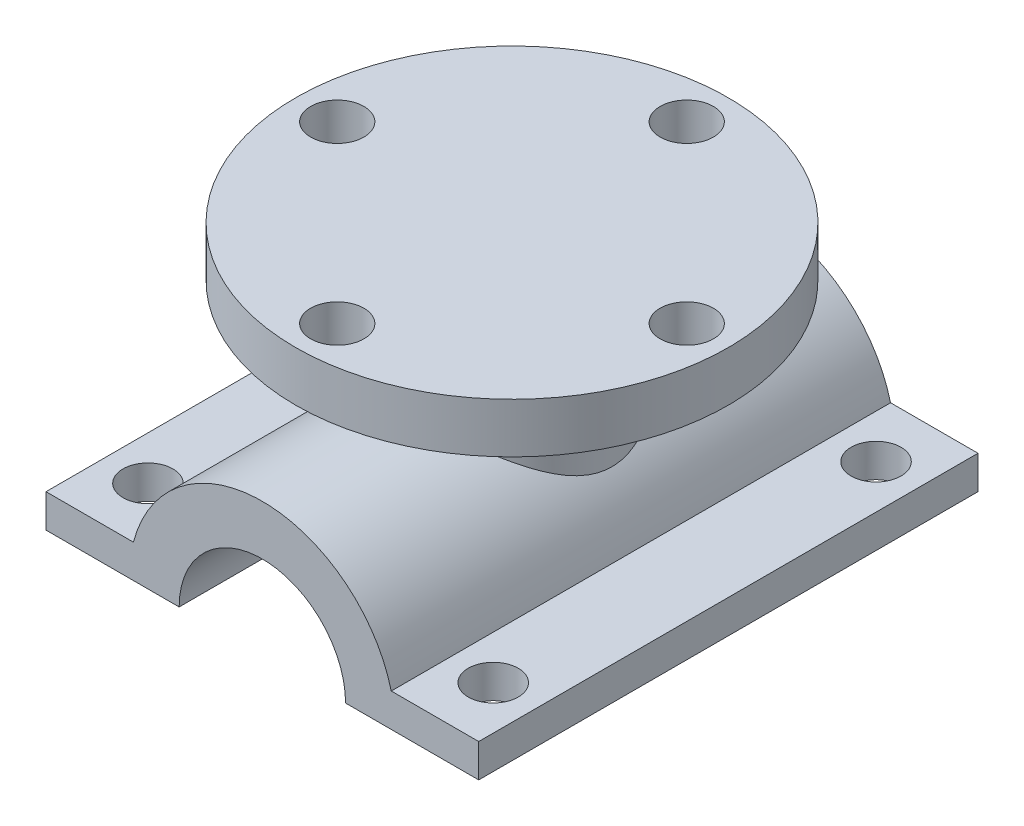
ISO-10303-21;
HEADER;
FILE_DESCRIPTION(('STEP AP214'),'2;1');
FILE_NAME('part.step','',(''),(''),'','','');
FILE_SCHEMA(('AUTOMOTIVE_DESIGN { 1 0 10303 214 1 1 1 1 }'));
ENDSEC;
DATA;
#1=APPLICATION_CONTEXT('core data for automotive mechanical design processes');
#2=APPLICATION_PROTOCOL_DEFINITION('international standard','automotive_design',2000,#1);
#3=PRODUCT_CONTEXT('',#1,'mechanical');
#4=PRODUCT('Part','Part','',(#3));
#5=PRODUCT_RELATED_PRODUCT_CATEGORY('part','',(#4));
#6=PRODUCT_DEFINITION_FORMATION('','',#4);
#7=PRODUCT_DEFINITION_CONTEXT('part definition',#1,'design');
#8=PRODUCT_DEFINITION('design','',#6,#7);
#9=PRODUCT_DEFINITION_SHAPE('','',#8);
#10=(LENGTH_UNIT() NAMED_UNIT(*) SI_UNIT(.MILLI.,.METRE.));
#11=(NAMED_UNIT(*) PLANE_ANGLE_UNIT() SI_UNIT($,.RADIAN.));
#12=(NAMED_UNIT(*) SI_UNIT($,.STERADIAN.) SOLID_ANGLE_UNIT());
#13=UNCERTAINTY_MEASURE_WITH_UNIT(LENGTH_MEASURE(1.E-05),#10,'distance_accuracy_value','');
#14=(GEOMETRIC_REPRESENTATION_CONTEXT(3) GLOBAL_UNCERTAINTY_ASSIGNED_CONTEXT((#13)) GLOBAL_UNIT_ASSIGNED_CONTEXT((#10,
#11,#12)) REPRESENTATION_CONTEXT('',''));
#15=CARTESIAN_POINT('',(0.,0.,0.));
#16=DIRECTION('',(0.,0.,1.));
#17=DIRECTION('',(1.,0.,0.));
#18=AXIS2_PLACEMENT_3D('',#15,#16,#17);
#19=CARTESIAN_POINT('',(13.,0.,30.));
#20=DIRECTION('',(-1.,0.,0.));
#21=DIRECTION('',(0.,0.,1.));
#22=AXIS2_PLACEMENT_3D('',#19,#20,#21);
#23=PLANE('',#22);
#24=DIRECTION('',(0.,1.,0.));
#25=VECTOR('',#24,1.);
#26=CARTESIAN_POINT('',(13.,0.,0.));
#27=LINE('',#26,#25);
#28=CARTESIAN_POINT('',(13.,0.,0.));
#29=VERTEX_POINT('',#28);
#30=CARTESIAN_POINT('',(13.,2.00000000000001,0.));
#31=VERTEX_POINT('',#30);
#32=EDGE_CURVE('E135',#29,#31,#27,.T.);
#33=ORIENTED_EDGE('',*,*,#32,.T.);
#34=DIRECTION('',(0.,0.,-1.));
#35=VECTOR('',#34,1.);
#36=CARTESIAN_POINT('',(13.,2.00000000000001,30.));
#37=LINE('',#36,#35);
#38=CARTESIAN_POINT('',(13.,2.00000000000001,30.));
#39=VERTEX_POINT('',#38);
#40=EDGE_CURVE('E11',#39,#31,#37,.T.);
#41=ORIENTED_EDGE('',*,*,#40,.F.);
#42=DIRECTION('',(0.,1.,0.));
#43=VECTOR('',#42,1.);
#44=CARTESIAN_POINT('',(13.,0.,30.));
#45=LINE('',#44,#43);
#46=CARTESIAN_POINT('',(13.,0.,30.));
#47=VERTEX_POINT('',#46);
#48=EDGE_CURVE('E152',#47,#39,#45,.T.);
#49=ORIENTED_EDGE('',*,*,#48,.F.);
#50=DIRECTION('',(0.,0.,-1.));
#51=VECTOR('',#50,1.);
#52=CARTESIAN_POINT('',(13.,0.,30.));
#53=LINE('',#52,#51);
#54=EDGE_CURVE('E131',#47,#29,#53,.T.);
#55=ORIENTED_EDGE('',*,*,#54,.T.);
#56=EDGE_LOOP('',(#33,#41,#49,#55));
#57=FACE_BOUND('',#56,.T.);
#58=ADVANCED_FACE('F37',(#57),#23,.F.);
#59=CARTESIAN_POINT('',(13.,2.00000000000001,30.));
#60=DIRECTION('',(0.,-1.,0.));
#61=DIRECTION('',(0.,0.,-1.));
#62=AXIS2_PLACEMENT_3D('',#59,#60,#61);
#63=PLANE('',#62);
#64=CARTESIAN_POINT('',(10.3729833462074,2.00000000000001,26.5));
#65=DIRECTION('',(0.,1.,0.));
#66=DIRECTION('',(0.,0.,-1.));
#67=AXIS2_PLACEMENT_3D('',#64,#65,#66);
#68=CIRCLE('',#67,1.5);
#69=CARTESIAN_POINT('',(10.3729833462074,2.00000000000001,25.));
#70=VERTEX_POINT('',#69);
#71=EDGE_CURVE('E170',#70,#70,#68,.T.);
#72=ORIENTED_EDGE('',*,*,#71,.F.);
#73=EDGE_LOOP('',(#72));
#74=FACE_BOUND('',#73,.T.);
#75=CARTESIAN_POINT('',(10.3729833462074,2.00000000000001,3.5));
#76=DIRECTION('',(0.,1.,0.));
#77=DIRECTION('',(0.,0.,1.));
#78=AXIS2_PLACEMENT_3D('',#75,#76,#77);
#79=CIRCLE('',#78,1.5);
#80=CARTESIAN_POINT('',(10.3729833462074,2.00000000000001,5.));
#81=VERTEX_POINT('',#80);
#82=EDGE_CURVE('E166',#81,#81,#79,.T.);
#83=ORIENTED_EDGE('',*,*,#82,.F.);
#84=EDGE_LOOP('',(#83));
#85=FACE_BOUND('',#84,.T.);
#86=DIRECTION('',(-1.,0.,0.));
#87=VECTOR('',#86,1.);
#88=CARTESIAN_POINT('',(13.,2.00000000000001,0.));
#89=LINE('',#88,#87);
#90=CARTESIAN_POINT('',(7.74596669241483,2.00000000000001,0.));
#91=VERTEX_POINT('',#90);
#92=EDGE_CURVE('E138',#31,#91,#89,.T.);
#93=ORIENTED_EDGE('',*,*,#92,.T.);
#94=DIRECTION('',(0.,0.,-1.));
#95=VECTOR('',#94,1.);
#96=CARTESIAN_POINT('',(7.74596669241483,2.00000000000001,30.));
#97=LINE('',#96,#95);
#98=CARTESIAN_POINT('',(7.74596669241483,2.00000000000001,30.));
#99=VERTEX_POINT('',#98);
#100=EDGE_CURVE('E46',#99,#91,#97,.T.);
#101=ORIENTED_EDGE('',*,*,#100,.F.);
#102=DIRECTION('',(-1.,0.,0.));
#103=VECTOR('',#102,1.);
#104=CARTESIAN_POINT('',(13.,2.00000000000001,30.));
#105=LINE('',#104,#103);
#106=EDGE_CURVE('E96',#39,#99,#105,.T.);
#107=ORIENTED_EDGE('',*,*,#106,.F.);
#108=ORIENTED_EDGE('',*,*,#40,.T.);
#109=EDGE_LOOP('',(#93,#101,#107,#108));
#110=FACE_BOUND('',#109,.T.);
#111=ADVANCED_FACE('F206',(#74,#85,#110),#63,.F.);
#112=CARTESIAN_POINT('',(0.,0.,30.));
#113=DIRECTION('',(0.,0.,-1.));
#114=DIRECTION('',(-1.,0.,0.));
#115=AXIS2_PLACEMENT_3D('',#112,#113,#114);
#116=CYLINDRICAL_SURFACE('',#115,8.);
#117=CARTESIAN_POINT('',(0.,8.,21.));
#118=CARTESIAN_POINT('',(0.146518688517614,7.99999860171174,20.9999985511193));
#119=CARTESIAN_POINT('',(0.293074068111853,7.99596497360399,20.9946232346861));
#120=CARTESIAN_POINT('',(0.585027718343882,7.97992114502227,20.9732060285274));
#121=CARTESIAN_POINT('',(0.730425243893793,7.96790617164547,20.9571577562897));
#122=CARTESIAN_POINT('',(1.01911421051197,7.93615343039507,20.914620197954));
#123=CARTESIAN_POINT('',(1.16240109542145,7.91640094683802,20.8881110159266));
#124=CARTESIAN_POINT('',(1.44559149803457,7.86961738087969,20.8250599741253));
#125=CARTESIAN_POINT('',(1.5854934751382,7.84258304970853,20.7885136361676));
#126=CARTESIAN_POINT('',(1.86005596235381,7.78201902509685,20.7061890573971));
#127=CARTESIAN_POINT('',(1.99474491007821,7.74853325374254,20.660473162003));
#128=CARTESIAN_POINT('',(2.25916456615398,7.6756119151885,20.560233330328));
#129=CARTESIAN_POINT('',(2.38889328753647,7.63617399433192,20.505705909102));
#130=CARTESIAN_POINT('',(2.76953920253634,7.51005474410354,20.3298817063899));
#131=CARTESIAN_POINT('',(3.012273741598,7.41548618409523,20.1962337259571));
#132=CARTESIAN_POINT('',(3.49390424837201,7.20197666544859,19.8869365657183));
#133=CARTESIAN_POINT('',(3.73036317555957,7.08158969751768,19.7085440040705));
#134=CARTESIAN_POINT('',(4.17211842741704,6.83066333270722,19.3220033083877));
#135=CARTESIAN_POINT('',(4.37736561247849,6.70010840618281,19.1138092351032));
#136=CARTESIAN_POINT('',(4.67986589059047,6.48984438794907,18.7589286014116));
#137=CARTESIAN_POINT('',(4.78758959632833,6.410578176494,18.6207390575536));
#138=CARTESIAN_POINT('',(4.99096674059027,6.25353789843468,18.3348224561947));
#139=CARTESIAN_POINT('',(5.08661653937945,6.1757642877447,18.1870925428961));
#140=CARTESIAN_POINT('',(5.26524223271028,6.02419554717128,17.8824230901489));
#141=CARTESIAN_POINT('',(5.34823079501831,5.95039648916912,17.7254929762279));
#142=CARTESIAN_POINT('',(5.50089012691617,5.80955994076358,17.4025256656703));
#143=CARTESIAN_POINT('',(5.5705684784342,5.74251861128099,17.2364937235224));
#144=CARTESIAN_POINT('',(5.71520702483237,5.59908765375948,16.8420371619106));
#145=CARTESIAN_POINT('',(5.78504300911228,5.52629839327616,16.6102967855957));
#146=CARTESIAN_POINT('',(5.86893397672821,5.43666164553995,16.2532242208379));
#147=CARTESIAN_POINT('',(5.89341250881845,5.41005011962253,16.1326938506795));
#148=CARTESIAN_POINT('',(5.93505989442207,5.36432877744824,15.8889986652319));
#149=CARTESIAN_POINT('',(5.95223251488978,5.3452150956732,15.7658352420438));
#150=CARTESIAN_POINT('',(5.9790556619836,5.31519589881473,15.5164922618646));
#151=CARTESIAN_POINT('',(5.98863344669945,5.30436979384548,15.3902951903145));
#152=CARTESIAN_POINT('',(5.99977184971055,5.2917681096814,15.1370931383009));
#153=CARTESIAN_POINT('',(6.00133268798461,5.28999228215396,15.0100881801009));
#154=CARTESIAN_POINT('',(5.99639499670829,5.29558896806401,14.7563943633534));
#155=CARTESIAN_POINT('',(5.98989382945216,5.30296447561165,14.6297056218563));
#156=CARTESIAN_POINT('',(5.96899506203212,5.32647466758105,14.3778345644773));
#157=CARTESIAN_POINT('',(5.9545973814167,5.34260944124424,14.2526522639567));
#158=CARTESIAN_POINT('',(5.90390904957868,5.39872796381231,13.9074002503925));
#159=CARTESIAN_POINT('',(5.85930415163496,5.44749150481953,13.6899155463838));
#160=CARTESIAN_POINT('',(5.748222143904,5.56456248634354,13.2661833957718));
#161=CARTESIAN_POINT('',(5.68172401138877,5.63288870344327,13.0599469729528));
#162=CARTESIAN_POINT('',(5.54333905811537,5.76879323120317,12.6974644133947));
#163=CARTESIAN_POINT('',(5.47477466886079,5.83413081061575,12.5390724609219));
#164=CARTESIAN_POINT('',(5.3254608957646,5.9707373272179,12.2307352134909));
#165=CARTESIAN_POINT('',(5.24470526282517,6.04200929786022,12.0807943048928));
#166=CARTESIAN_POINT('',(5.07146578081446,6.18814258493399,11.7892289312608));
#167=CARTESIAN_POINT('',(4.97895793325041,6.2630110453211,11.6476223763984));
#168=CARTESIAN_POINT('',(4.7827554148967,6.41409242955882,11.3731976924959));
#169=CARTESIAN_POINT('',(4.67906249805253,6.49030514105232,11.2403781908011));
#170=CARTESIAN_POINT('',(4.4579792240858,6.64417162615227,10.9805160391634));
#171=CARTESIAN_POINT('',(4.34030912342675,6.72181319795033,10.8537039264378));
#172=CARTESIAN_POINT('',(4.09367222460927,6.87480250679446,10.6100229628637));
#173=CARTESIAN_POINT('',(3.96470428502761,6.95015001103169,10.4931551190436));
#174=CARTESIAN_POINT('',(3.69597060021907,7.09670231877689,10.2702838101556));
#175=CARTESIAN_POINT('',(3.55622538384291,7.1679145666095,10.164260542811));
#176=CARTESIAN_POINT('',(3.26604522385211,7.30470177438955,9.96372731406355));
#177=CARTESIAN_POINT('',(3.11560943413715,7.37027628723149,9.86921826555847));
#178=CARTESIAN_POINT('',(2.83586827048309,7.48169451334742,9.71055149549934));
#179=CARTESIAN_POINT('',(2.70837998934688,7.52885710323929,9.64410881277339));
#180=CARTESIAN_POINT('',(2.44739928983847,7.61769167951136,9.51993529825344));
#181=CARTESIAN_POINT('',(2.31390811354263,7.65936479478648,9.46220267490442));
#182=CARTESIAN_POINT('',(2.0415115520491,7.73642422498135,9.35610158879799));
#183=CARTESIAN_POINT('',(1.90260706454461,7.7718115769097,9.30773158130267));
#184=CARTESIAN_POINT('',(1.62018599744481,7.83555620403262,9.22100305478879));
#185=CARTESIAN_POINT('',(1.47667131977371,7.86391633726368,9.18264046532221));
#186=CARTESIAN_POINT('',(1.18499204510426,7.91314134113104,9.11626774735322));
#187=CARTESIAN_POINT('',(1.03680340577379,7.93395662867835,9.08832606933028));
#188=CARTESIAN_POINT('',(0.737821571994131,7.96732338861309,9.04361991207435));
#189=CARTESIAN_POINT('',(0.587028371203791,7.97987484087822,9.02685546005774));
#190=CARTESIAN_POINT('',(0.284184390334594,7.99638843748762,9.00481181003356));
#191=CARTESIAN_POINT('',(0.132134046612352,8.00035344612225,8.99952878201774));
#192=CARTESIAN_POINT('',(-0.171899277805928,7.99959713902348,9.00053710453727));
#193=CARTESIAN_POINT('',(-0.323882262866091,7.99487650776092,9.00682754302697));
#194=CARTESIAN_POINT('',(-0.611142673469311,7.97778638650465,9.02964617704497));
#195=CARTESIAN_POINT('',(-0.7465583658625,7.96623673496005,9.04507732941892));
#196=CARTESIAN_POINT('',(-1.0153507469799,7.93645725947853,9.08497421742194));
#197=CARTESIAN_POINT('',(-1.14872674222336,7.91822521396577,9.10944295763692));
#198=CARTESIAN_POINT('',(-1.41251726020976,7.87544532731612,9.16707508668537));
#199=CARTESIAN_POINT('',(-1.54293249033533,7.85089901243256,9.2002363744369));
#200=CARTESIAN_POINT('',(-1.80012948638602,7.79595168173508,9.27483687349558));
#201=CARTESIAN_POINT('',(-1.92690982427817,7.76554840015569,9.31627928858587));
#202=CARTESIAN_POINT('',(-2.3095170673646,7.66401781204718,9.45551215601688));
#203=CARTESIAN_POINT('',(-2.55847497362715,7.58408997744736,9.56619347560665));
#204=CARTESIAN_POINT('',(-3.03411583046433,7.40667144953611,9.81670107336273));
#205=CARTESIAN_POINT('',(-3.26079569312705,7.30917832682886,9.9565313834483));
#206=CARTESIAN_POINT('',(-3.72602689057998,7.08477436942263,10.2871247782514));
#207=CARTESIAN_POINT('',(-3.96023886187635,6.95566976373454,10.4824939104476));
#208=CARTESIAN_POINT('',(-4.39490724546058,6.68953209193099,10.904055302922));
#209=CARTESIAN_POINT('',(-4.59528664972402,6.55248186732465,11.1303158163422));
#210=CARTESIAN_POINT('',(-4.88646983567337,6.33567894152941,11.5136488309429));
#211=CARTESIAN_POINT('',(-4.98880902725893,6.25517542108845,11.6616831775871));
#212=CARTESIAN_POINT('',(-5.18051065872929,6.09735213917022,11.9676859949913));
#213=CARTESIAN_POINT('',(-5.26986833077173,6.02003355488604,12.1256580853055));
#214=CARTESIAN_POINT('',(-5.43468173346092,5.87166976966668,12.4510027023141));
#215=CARTESIAN_POINT('',(-5.51017014215578,5.80061003328339,12.6183518876267));
#216=CARTESIAN_POINT('',(-5.64645066864905,5.66803470374607,12.9623934193642));
#217=CARTESIAN_POINT('',(-5.70725497051843,5.60651121322429,13.139077870485));
#218=CARTESIAN_POINT('',(-5.82460895757243,5.48476590620909,13.5416166657081));
#219=CARTESIAN_POINT('',(-5.87724209021694,5.42784261454642,13.7697020295325));
#220=CARTESIAN_POINT('',(-5.93609963223252,5.36316560199242,14.1187089337762));
#221=CARTESIAN_POINT('',(-5.95236673030502,5.34506213871908,14.2361254252971));
#222=CARTESIAN_POINT('',(-5.97795743368828,5.31642768928263,14.4726095494409));
#223=CARTESIAN_POINT('',(-5.98728413098441,5.30589333111518,14.5916764226983));
#224=CARTESIAN_POINT('',(-5.99883169968423,5.29283429529154,14.831238008097));
#225=CARTESIAN_POINT('',(-6.00101405659181,5.2903530317579,14.9517369560011));
#226=CARTESIAN_POINT('',(-5.99811868579162,5.29363550978566,15.1925316501397));
#227=CARTESIAN_POINT('',(-5.99304111065809,5.29939907807423,15.3128274005915));
#228=CARTESIAN_POINT('',(-5.97572919486202,5.31891233991742,15.552353152662));
#229=CARTESIAN_POINT('',(-5.9634882595833,5.33266939222049,15.6715820693278));
#230=CARTESIAN_POINT('',(-5.93208637284381,5.36757846353789,15.9080711125112));
#231=CARTESIAN_POINT('',(-5.91292183985972,5.38873430970951,16.0253301871311));
#232=CARTESIAN_POINT('',(-5.86311195375073,5.44293592885852,16.2824148629292));
#233=CARTESIAN_POINT('',(-5.83087573361472,5.47756729109551,16.4215980569014));
#234=CARTESIAN_POINT('',(-5.75726364998312,5.55488600019637,16.6952955344529));
#235=CARTESIAN_POINT('',(-5.71588088856811,5.59757942355467,16.8298062051523));
#236=CARTESIAN_POINT('',(-5.6245073374202,5.68938628410066,17.0939158758013));
#237=CARTESIAN_POINT('',(-5.57449949488315,5.73851239222894,17.223504512896));
#238=CARTESIAN_POINT('',(-5.46646540651011,5.84151757539994,17.477250112343));
#239=CARTESIAN_POINT('',(-5.40844160385242,5.89539520042894,17.6014087145883));
#240=CARTESIAN_POINT('',(-5.26327089727895,6.02582021867716,17.8864684739675));
#241=CARTESIAN_POINT('',(-5.17300719309855,6.10374359682442,18.0451591677733));
#242=CARTESIAN_POINT('',(-4.97927518139019,6.26279038035042,18.352587513395));
#243=CARTESIAN_POINT('',(-4.87580275952897,6.3439147773393,18.5013220419037));
#244=CARTESIAN_POINT('',(-4.65600132814074,6.50694942892141,18.7887198540164));
#245=CARTESIAN_POINT('',(-4.53966269090393,6.5888602295477,18.9273754652869));
#246=CARTESIAN_POINT('',(-4.29448893143754,6.75122092144022,19.1940631458905));
#247=CARTESIAN_POINT('',(-4.16565532793779,6.83167098884699,19.3220965028289));
#248=CARTESIAN_POINT('',(-3.89458755688547,6.98977923794182,19.5679252577415));
#249=CARTESIAN_POINT('',(-3.75224983935823,7.06740826329899,19.6856255393087));
#250=CARTESIAN_POINT('',(-3.45541107812887,7.21718567908661,19.9086239934375));
#251=CARTESIAN_POINT('',(-3.30090844848128,7.28933335249337,20.0139205444371));
#252=CARTESIAN_POINT('',(-2.98061143647042,7.42605002859304,20.2106825322114));
#253=CARTESIAN_POINT('',(-2.81483934314606,7.49063334052017,20.3021741809723));
#254=CARTESIAN_POINT('',(-2.47266590036615,7.61043577208661,20.4701184414184));
#255=CARTESIAN_POINT('',(-2.29627009831934,7.66565972244304,20.5465788145878));
#256=CARTESIAN_POINT('',(-1.98729924659673,7.75037220901379,20.6629811381972));
#257=CARTESIAN_POINT('',(-1.85703204648843,7.78265986356722,20.7070583931906));
#258=CARTESIAN_POINT('',(-1.59251360947636,7.84106039682812,20.786445631864));
#259=CARTESIAN_POINT('',(-1.45826334888023,7.86717477485216,20.821757744457));
#260=CARTESIAN_POINT('',(-1.18687071595699,7.9126625457054,20.8830816763811));
#261=CARTESIAN_POINT('',(-1.04973581981943,7.93205151969831,20.9091149963802));
#262=CARTESIAN_POINT('',(-0.773232321071559,7.96375884575939,20.9516095671978));
#263=CARTESIAN_POINT('',(-0.633864898300129,7.9760808135925,20.9680757130241));
#264=CARTESIAN_POINT('',(-0.411868725546895,7.98981401501972,20.9864134412648));
#265=CARTESIAN_POINT('',(-0.329635968371187,7.99363034191046,20.991504921489));
#266=CARTESIAN_POINT('',(-0.164939372783556,7.9987239323169,20.998298881423));
#267=CARTESIAN_POINT('',(-0.0824754993114478,8.0000007870977,21.0000008155762));
#268=CARTESIAN_POINT('',(0.,8.,21.));
#269=B_SPLINE_CURVE_WITH_KNOTS('',3,(#117,#118,#119,#120,#121,#122,#123,#124,#125,#126,#127,
#128,#129,#130,#131,#132,#133,#134,#135,#136,#137,#138,#139,#140,#141,#142,#143,#144,#145,#146,
#147,#148,#149,#150,#151,#152,#153,#154,#155,#156,#157,#158,#159,#160,#161,#162,#163,#164,#165,
#166,#167,#168,#169,#170,#171,#172,#173,#174,#175,#176,#177,#178,#179,#180,#181,#182,#183,#184,
#185,#186,#187,#188,#189,#190,#191,#192,#193,#194,#195,#196,#197,#198,#199,#200,#201,#202,#203,
#204,#205,#206,#207,#208,#209,#210,#211,#212,#213,#214,#215,#216,#217,#218,#219,#220,#221,#222,
#223,#224,#225,#226,#227,#228,#229,#230,#231,#232,#233,#234,#235,#236,#237,#238,#239,#240,#241,
#242,#243,#244,#245,#246,#247,#248,#249,#250,#251,#252,#253,#254,#255,#256,#257,#258,#259,#260,
#261,#262,#263,#264,#265,#266,#267,#268),.UNSPECIFIED.,.T.,.F.,(4,2,2,2,2,2,2,2,2,2,2,2,2,2,2,2,
2,2,2,2,2,2,2,2,2,2,2,2,2,2,2,2,2,2,2,2,2,2,2,2,2,2,2,2,2,2,2,2,2,2,2,2,2,2,2,2,2,2,2,2,2,2,2,2,
2,2,2,2,2,2,2,2,2,2,2,4),(0.,0.439467048380189,0.879197138137982,1.31976762661366,
1.76053500052094,2.19840134580811,2.63644129232571,3.51138555342935,4.46735321072937,
5.42481069423868,6.00121633672613,6.5777953264835,7.1537936024139,7.72946278616466,
8.48458056510052,8.86171322500425,9.23865119759487,9.61915721770104,9.99965279695978,
10.3802728986114,10.7608968781809,11.4400527126809,12.1198626101981,12.672786977991,
13.2259957371829,13.780352897294,14.3346232539532,14.9028885365166,15.4712112974088,
16.0384770407193,16.6057877301157,17.0592631596221,17.5126451871165,17.9659523472326,
18.4190748392931,18.8751233602148,19.331172991604,19.7870704692072,20.2429320214021,
20.6527966790804,21.0627977208993,21.4726997523065,21.8827606737579,22.7310038456726,
23.5793644254271,24.5694015495634,25.5616626256784,26.1525200779509,26.7435939942103,
27.3332568743273,27.9224287902262,28.6419314131392,29.0012926759905,29.3604937454876,
29.7216280742576,30.0827548135647,30.4442145316698,30.8058614984406,31.2462116660305,
31.6868950664312,32.1284599525693,32.5698905501962,33.1645896617993,33.7594744680456,
34.3548074740317,34.9500682093494,35.5503331474219,36.1506764723155,36.7498651522011,
37.348743620251,37.7721112122056,38.1953758741031,38.6176532780524,39.0397144346929,
39.2870510185101,39.5344274085992),.UNSPECIFIED.);
#270=CARTESIAN_POINT('',(0.,8.,21.));
#271=VERTEX_POINT('',#270);
#272=EDGE_CURVE('E397',#271,#271,#269,.T.);
#273=ORIENTED_EDGE('',*,*,#272,.F.);
#274=EDGE_LOOP('',(#273));
#275=FACE_BOUND('',#274,.T.);
#276=CARTESIAN_POINT('',(0.,0.,0.));
#277=DIRECTION('',(0.,0.,1.));
#278=DIRECTION('',(1.,0.,0.));
#279=AXIS2_PLACEMENT_3D('',#276,#277,#278);
#280=CIRCLE('',#279,8.);
#281=CARTESIAN_POINT('',(-7.74596669241483,2.,0.));
#282=VERTEX_POINT('',#281);
#283=EDGE_CURVE('E141',#91,#282,#280,.T.);
#284=ORIENTED_EDGE('',*,*,#283,.T.);
#285=DIRECTION('',(0.,0.,-1.));
#286=VECTOR('',#285,1.);
#287=CARTESIAN_POINT('',(-7.74596669241483,2.,30.));
#288=LINE('',#287,#286);
#289=CARTESIAN_POINT('',(-7.74596669241483,2.,30.));
#290=VERTEX_POINT('',#289);
#291=EDGE_CURVE('E159',#290,#282,#288,.T.);
#292=ORIENTED_EDGE('',*,*,#291,.F.);
#293=CARTESIAN_POINT('',(0.,0.,30.));
#294=DIRECTION('',(0.,0.,1.));
#295=DIRECTION('',(1.,0.,0.));
#296=AXIS2_PLACEMENT_3D('',#293,#294,#295);
#297=CIRCLE('',#296,8.);
#298=EDGE_CURVE('E187',#99,#290,#297,.T.);
#299=ORIENTED_EDGE('',*,*,#298,.F.);
#300=ORIENTED_EDGE('',*,*,#100,.T.);
#301=EDGE_LOOP('',(#284,#292,#299,#300));
#302=FACE_BOUND('',#301,.T.);
#303=ADVANCED_FACE('F208',(#275,#302),#116,.T.);
#304=CARTESIAN_POINT('',(-13.,2.,30.));
#305=DIRECTION('',(0.,-1.,0.));
#306=DIRECTION('',(0.,0.,-1.));
#307=AXIS2_PLACEMENT_3D('',#304,#305,#306);
#308=PLANE('',#307);
#309=CARTESIAN_POINT('',(-10.3729833462074,2.00000000000001,26.5));
#310=DIRECTION('',(0.,1.,0.));
#311=DIRECTION('',(0.,0.,1.));
#312=AXIS2_PLACEMENT_3D('',#309,#310,#311);
#313=CIRCLE('',#312,1.5);
#314=CARTESIAN_POINT('',(-10.3729833462074,2.00000000000001,28.));
#315=VERTEX_POINT('',#314);
#316=EDGE_CURVE('E406',#315,#315,#313,.T.);
#317=ORIENTED_EDGE('',*,*,#316,.F.);
#318=EDGE_LOOP('',(#317));
#319=FACE_BOUND('',#318,.T.);
#320=CARTESIAN_POINT('',(-10.3729833462074,2.00000000000001,3.50000000000001));
#321=DIRECTION('',(0.,1.,0.));
#322=DIRECTION('',(0.,0.,-1.));
#323=AXIS2_PLACEMENT_3D('',#320,#321,#322);
#324=CIRCLE('',#323,1.5);
#325=CARTESIAN_POINT('',(-10.3729833462074,2.00000000000001,2.00000000000001));
#326=VERTEX_POINT('',#325);
#327=EDGE_CURVE('E183',#326,#326,#324,.T.);
#328=ORIENTED_EDGE('',*,*,#327,.F.);
#329=EDGE_LOOP('',(#328));
#330=FACE_BOUND('',#329,.T.);
#331=DIRECTION('',(-1.,0.,0.));
#332=VECTOR('',#331,1.);
#333=CARTESIAN_POINT('',(-13.,2.,0.));
#334=LINE('',#333,#332);
#335=CARTESIAN_POINT('',(-13.,2.,0.));
#336=VERTEX_POINT('',#335);
#337=EDGE_CURVE('E143',#282,#336,#334,.T.);
#338=ORIENTED_EDGE('',*,*,#337,.T.);
#339=DIRECTION('',(0.,0.,-1.));
#340=VECTOR('',#339,1.);
#341=CARTESIAN_POINT('',(-13.,2.,30.));
#342=LINE('',#341,#340);
#343=CARTESIAN_POINT('',(-13.,2.,30.));
#344=VERTEX_POINT('',#343);
#345=EDGE_CURVE('E156',#344,#336,#342,.T.);
#346=ORIENTED_EDGE('',*,*,#345,.F.);
#347=DIRECTION('',(-1.,0.,0.));
#348=VECTOR('',#347,1.);
#349=CARTESIAN_POINT('',(-13.,2.,30.));
#350=LINE('',#349,#348);
#351=EDGE_CURVE('E189',#290,#344,#350,.T.);
#352=ORIENTED_EDGE('',*,*,#351,.F.);
#353=ORIENTED_EDGE('',*,*,#291,.T.);
#354=EDGE_LOOP('',(#338,#346,#352,#353));
#355=FACE_BOUND('',#354,.T.);
#356=ADVANCED_FACE('F195',(#319,#330,#355),#308,.F.);
#357=CARTESIAN_POINT('',(-13.,0.,30.));
#358=DIRECTION('',(1.,0.,0.));
#359=DIRECTION('',(0.,0.,-1.));
#360=AXIS2_PLACEMENT_3D('',#357,#358,#359);
#361=PLANE('',#360);
#362=DIRECTION('',(0.,-1.,0.));
#363=VECTOR('',#362,1.);
#364=CARTESIAN_POINT('',(-13.,0.,0.));
#365=LINE('',#364,#363);
#366=CARTESIAN_POINT('',(-13.,0.,0.));
#367=VERTEX_POINT('',#366);
#368=EDGE_CURVE('E145',#336,#367,#365,.T.);
#369=ORIENTED_EDGE('',*,*,#368,.T.);
#370=DIRECTION('',(0.,0.,-1.));
#371=VECTOR('',#370,1.);
#372=CARTESIAN_POINT('',(-13.,0.,30.));
#373=LINE('',#372,#371);
#374=CARTESIAN_POINT('',(-13.,0.,30.));
#375=VERTEX_POINT('',#374);
#376=EDGE_CURVE('E126',#375,#367,#373,.T.);
#377=ORIENTED_EDGE('',*,*,#376,.F.);
#378=DIRECTION('',(0.,-1.,0.));
#379=VECTOR('',#378,1.);
#380=CARTESIAN_POINT('',(-13.,0.,30.));
#381=LINE('',#380,#379);
#382=EDGE_CURVE('E116',#344,#375,#381,.T.);
#383=ORIENTED_EDGE('',*,*,#382,.F.);
#384=ORIENTED_EDGE('',*,*,#345,.T.);
#385=EDGE_LOOP('',(#369,#377,#383,#384));
#386=FACE_BOUND('',#385,.T.);
#387=ADVANCED_FACE('F199',(#386),#361,.F.);
#388=CARTESIAN_POINT('',(-8.,0.,30.));
#389=DIRECTION('',(0.,1.,0.));
#390=DIRECTION('',(0.,0.,1.));
#391=AXIS2_PLACEMENT_3D('',#388,#389,#390);
#392=PLANE('',#391);
#393=CARTESIAN_POINT('',(-10.3729833462074,0.,26.5));
#394=DIRECTION('',(0.,1.,0.));
#395=DIRECTION('',(0.,0.,1.));
#396=AXIS2_PLACEMENT_3D('',#393,#394,#395);
#397=CIRCLE('',#396,1.5);
#398=CARTESIAN_POINT('',(-10.3729833462074,0.,28.));
#399=VERTEX_POINT('',#398);
#400=EDGE_CURVE('E40',#399,#399,#397,.T.);
#401=ORIENTED_EDGE('',*,*,#400,.T.);
#402=EDGE_LOOP('',(#401));
#403=FACE_BOUND('',#402,.T.);
#404=CARTESIAN_POINT('',(-10.3729833462074,0.,3.50000000000001));
#405=DIRECTION('',(0.,1.,0.));
#406=DIRECTION('',(0.,0.,1.));
#407=AXIS2_PLACEMENT_3D('',#404,#405,#406);
#408=CIRCLE('',#407,1.5);
#409=CARTESIAN_POINT('',(-10.3729833462074,0.,5.00000000000001));
#410=VERTEX_POINT('',#409);
#411=EDGE_CURVE('E169',#410,#410,#408,.T.);
#412=ORIENTED_EDGE('',*,*,#411,.T.);
#413=EDGE_LOOP('',(#412));
#414=FACE_BOUND('',#413,.T.);
#415=DIRECTION('',(1.,0.,0.));
#416=VECTOR('',#415,1.);
#417=CARTESIAN_POINT('',(-8.,0.,0.));
#418=LINE('',#417,#416);
#419=CARTESIAN_POINT('',(-5.,0.,0.));
#420=VERTEX_POINT('',#419);
#421=EDGE_CURVE('E124',#367,#420,#418,.T.);
#422=ORIENTED_EDGE('',*,*,#421,.T.);
#423=DIRECTION('',(0.,0.,-1.));
#424=VECTOR('',#423,1.);
#425=CARTESIAN_POINT('',(-5.,0.,30.));
#426=LINE('',#425,#424);
#427=CARTESIAN_POINT('',(-5.,0.,30.));
#428=VERTEX_POINT('',#427);
#429=EDGE_CURVE('E122',#428,#420,#426,.T.);
#430=ORIENTED_EDGE('',*,*,#429,.F.);
#431=DIRECTION('',(1.,0.,0.));
#432=VECTOR('',#431,1.);
#433=CARTESIAN_POINT('',(-8.,0.,30.));
#434=LINE('',#433,#432);
#435=EDGE_CURVE('E109',#375,#428,#434,.T.);
#436=ORIENTED_EDGE('',*,*,#435,.F.);
#437=ORIENTED_EDGE('',*,*,#376,.T.);
#438=EDGE_LOOP('',(#422,#430,#436,#437));
#439=FACE_BOUND('',#438,.T.);
#440=ADVANCED_FACE('F123',(#403,#414,#439),#392,.F.);
#441=CARTESIAN_POINT('',(0.,0.,30.));
#442=DIRECTION('',(0.,0.,-1.));
#443=DIRECTION('',(-1.,0.,0.));
#444=AXIS2_PLACEMENT_3D('',#441,#442,#443);
#445=CYLINDRICAL_SURFACE('',#444,5.);
#446=CARTESIAN_POINT('',(0.,0.,0.));
#447=DIRECTION('',(0.,0.,-1.));
#448=DIRECTION('',(1.,0.,0.));
#449=AXIS2_PLACEMENT_3D('',#446,#447,#448);
#450=CIRCLE('',#449,5.);
#451=CARTESIAN_POINT('',(5.,0.,0.));
#452=VERTEX_POINT('',#451);
#453=EDGE_CURVE('E149',#420,#452,#450,.T.);
#454=ORIENTED_EDGE('',*,*,#453,.T.);
#455=DIRECTION('',(0.,0.,-1.));
#456=VECTOR('',#455,1.);
#457=CARTESIAN_POINT('',(5.,0.,30.));
#458=LINE('',#457,#456);
#459=CARTESIAN_POINT('',(5.,0.,30.));
#460=VERTEX_POINT('',#459);
#461=EDGE_CURVE('E127',#460,#452,#458,.T.);
#462=ORIENTED_EDGE('',*,*,#461,.F.);
#463=CARTESIAN_POINT('',(0.,0.,30.));
#464=DIRECTION('',(0.,0.,-1.));
#465=DIRECTION('',(1.,0.,0.));
#466=AXIS2_PLACEMENT_3D('',#463,#464,#465);
#467=CIRCLE('',#466,5.);
#468=EDGE_CURVE('E113',#428,#460,#467,.T.);
#469=ORIENTED_EDGE('',*,*,#468,.F.);
#470=ORIENTED_EDGE('',*,*,#429,.T.);
#471=EDGE_LOOP('',(#454,#462,#469,#470));
#472=FACE_BOUND('',#471,.T.);
#473=ADVANCED_FACE('F129',(#472),#445,.F.);
#474=CARTESIAN_POINT('',(8.,0.,30.));
#475=DIRECTION('',(0.,1.,0.));
#476=DIRECTION('',(-1.,0.,0.));
#477=AXIS2_PLACEMENT_3D('',#474,#475,#476);
#478=PLANE('',#477);
#479=CARTESIAN_POINT('',(10.3729833462074,0.,26.5));
#480=DIRECTION('',(0.,1.,0.));
#481=DIRECTION('',(-1.,0.,0.));
#482=AXIS2_PLACEMENT_3D('',#479,#480,#481);
#483=CIRCLE('',#482,1.5);
#484=CARTESIAN_POINT('',(8.87298334620742,0.,26.5));
#485=VERTEX_POINT('',#484);
#486=EDGE_CURVE('E167',#485,#485,#483,.T.);
#487=ORIENTED_EDGE('',*,*,#486,.T.);
#488=EDGE_LOOP('',(#487));
#489=FACE_BOUND('',#488,.T.);
#490=CARTESIAN_POINT('',(10.3729833462074,0.,3.5));
#491=DIRECTION('',(0.,1.,0.));
#492=DIRECTION('',(-1.,0.,0.));
#493=AXIS2_PLACEMENT_3D('',#490,#491,#492);
#494=CIRCLE('',#493,1.5);
#495=CARTESIAN_POINT('',(8.87298334620741,0.,3.5));
#496=VERTEX_POINT('',#495);
#497=EDGE_CURVE('E139',#496,#496,#494,.T.);
#498=ORIENTED_EDGE('',*,*,#497,.T.);
#499=EDGE_LOOP('',(#498));
#500=FACE_BOUND('',#499,.T.);
#501=DIRECTION('',(1.,0.,0.));
#502=VECTOR('',#501,1.);
#503=CARTESIAN_POINT('',(8.,0.,0.));
#504=LINE('',#503,#502);
#505=EDGE_CURVE('E84',#452,#29,#504,.T.);
#506=ORIENTED_EDGE('',*,*,#505,.T.);
#507=ORIENTED_EDGE('',*,*,#54,.F.);
#508=DIRECTION('',(1.,0.,0.));
#509=VECTOR('',#508,1.);
#510=CARTESIAN_POINT('',(8.,0.,30.));
#511=LINE('',#510,#509);
#512=EDGE_CURVE('E55',#460,#47,#511,.T.);
#513=ORIENTED_EDGE('',*,*,#512,.F.);
#514=ORIENTED_EDGE('',*,*,#461,.T.);
#515=EDGE_LOOP('',(#506,#507,#513,#514));
#516=FACE_BOUND('',#515,.T.);
#517=ADVANCED_FACE('F202',(#489,#500,#516),#478,.F.);
#518=CARTESIAN_POINT('',(0.,0.,30.));
#519=DIRECTION('',(0.,0.,1.));
#520=DIRECTION('',(1.,0.,0.));
#521=AXIS2_PLACEMENT_3D('',#518,#519,#520);
#522=PLANE('',#521);
#523=ORIENTED_EDGE('',*,*,#48,.T.);
#524=ORIENTED_EDGE('',*,*,#106,.T.);
#525=ORIENTED_EDGE('',*,*,#298,.T.);
#526=ORIENTED_EDGE('',*,*,#351,.T.);
#527=ORIENTED_EDGE('',*,*,#382,.T.);
#528=ORIENTED_EDGE('',*,*,#435,.T.);
#529=ORIENTED_EDGE('',*,*,#468,.T.);
#530=ORIENTED_EDGE('',*,*,#512,.T.);
#531=EDGE_LOOP('',(#523,#524,#525,#526,#527,#528,#529,#530));
#532=FACE_BOUND('',#531,.T.);
#533=ADVANCED_FACE('F111',(#532),#522,.T.);
#534=CARTESIAN_POINT('',(0.,0.,0.));
#535=DIRECTION('',(0.,0.,1.));
#536=DIRECTION('',(1.,0.,0.));
#537=AXIS2_PLACEMENT_3D('',#534,#535,#536);
#538=PLANE('',#537);
#539=ORIENTED_EDGE('',*,*,#32,.F.);
#540=ORIENTED_EDGE('',*,*,#505,.F.);
#541=ORIENTED_EDGE('',*,*,#453,.F.);
#542=ORIENTED_EDGE('',*,*,#421,.F.);
#543=ORIENTED_EDGE('',*,*,#368,.F.);
#544=ORIENTED_EDGE('',*,*,#337,.F.);
#545=ORIENTED_EDGE('',*,*,#283,.F.);
#546=ORIENTED_EDGE('',*,*,#92,.F.);
#547=EDGE_LOOP('',(#539,#540,#541,#542,#543,#544,#545,#546));
#548=FACE_BOUND('',#547,.T.);
#549=ADVANCED_FACE('F200',(#548),#538,.F.);
#550=CARTESIAN_POINT('',(10.3729833462074,-28.,3.5));
#551=DIRECTION('',(0.,1.,0.));
#552=DIRECTION('',(0.,0.,1.));
#553=AXIS2_PLACEMENT_3D('',#550,#551,#552);
#554=CYLINDRICAL_SURFACE('',#553,1.5);
#555=ORIENTED_EDGE('',*,*,#82,.T.);
#556=EDGE_LOOP('',(#555));
#557=FACE_BOUND('',#556,.T.);
#558=ORIENTED_EDGE('',*,*,#497,.F.);
#559=EDGE_LOOP('',(#558));
#560=FACE_BOUND('',#559,.T.);
#561=ADVANCED_FACE('F270',(#557,#560),#554,.F.);
#562=CARTESIAN_POINT('',(10.3729833462074,-28.,26.5));
#563=DIRECTION('',(0.,1.,0.));
#564=DIRECTION('',(0.,0.,1.));
#565=AXIS2_PLACEMENT_3D('',#562,#563,#564);
#566=CYLINDRICAL_SURFACE('',#565,1.5);
#567=ORIENTED_EDGE('',*,*,#71,.T.);
#568=EDGE_LOOP('',(#567));
#569=FACE_BOUND('',#568,.T.);
#570=ORIENTED_EDGE('',*,*,#486,.F.);
#571=EDGE_LOOP('',(#570));
#572=FACE_BOUND('',#571,.T.);
#573=ADVANCED_FACE('F275',(#569,#572),#566,.F.);
#574=CARTESIAN_POINT('',(-10.3729833462074,-28.,3.50000000000001));
#575=DIRECTION('',(0.,1.,0.));
#576=DIRECTION('',(0.,0.,1.));
#577=AXIS2_PLACEMENT_3D('',#574,#575,#576);
#578=CYLINDRICAL_SURFACE('',#577,1.5);
#579=ORIENTED_EDGE('',*,*,#327,.T.);
#580=EDGE_LOOP('',(#579));
#581=FACE_BOUND('',#580,.T.);
#582=ORIENTED_EDGE('',*,*,#411,.F.);
#583=EDGE_LOOP('',(#582));
#584=FACE_BOUND('',#583,.T.);
#585=ADVANCED_FACE('F284',(#581,#584),#578,.F.);
#586=CARTESIAN_POINT('',(-10.3729833462074,-28.,26.5));
#587=DIRECTION('',(0.,1.,0.));
#588=DIRECTION('',(0.,0.,1.));
#589=AXIS2_PLACEMENT_3D('',#586,#587,#588);
#590=CYLINDRICAL_SURFACE('',#589,1.5);
#591=ORIENTED_EDGE('',*,*,#316,.T.);
#592=EDGE_LOOP('',(#591));
#593=FACE_BOUND('',#592,.T.);
#594=ORIENTED_EDGE('',*,*,#400,.F.);
#595=EDGE_LOOP('',(#594));
#596=FACE_BOUND('',#595,.T.);
#597=ADVANCED_FACE('F294',(#593,#596),#590,.F.);
#598=CARTESIAN_POINT('',(0.,-0.001000000000001,15.));
#599=DIRECTION('',(0.,1.,0.));
#600=DIRECTION('',(0.,0.,1.));
#601=AXIS2_PLACEMENT_3D('',#598,#599,#600);
#602=CYLINDRICAL_SURFACE('',#601,6.);
#603=CARTESIAN_POINT('',(0.,12.,15.));
#604=DIRECTION('',(0.,1.,0.));
#605=DIRECTION('',(0.,0.,1.));
#606=AXIS2_PLACEMENT_3D('',#603,#604,#605);
#607=CIRCLE('',#606,6.);
#608=CARTESIAN_POINT('',(0.,12.,21.));
#609=VERTEX_POINT('',#608);
#610=EDGE_CURVE('E403',#609,#609,#607,.T.);
#611=ORIENTED_EDGE('',*,*,#610,.F.);
#612=EDGE_LOOP('',(#611));
#613=FACE_BOUND('',#612,.T.);
#614=ORIENTED_EDGE('',*,*,#272,.T.);
#615=EDGE_LOOP('',(#614));
#616=FACE_BOUND('',#615,.T.);
#617=ADVANCED_FACE('F303',(#613,#616),#602,.T.);
#618=CARTESIAN_POINT('',(0.,15.,15.));
#619=DIRECTION('',(0.,-1.,0.));
#620=DIRECTION('',(0.,0.,-1.));
#621=AXIS2_PLACEMENT_3D('',#618,#619,#620);
#622=CYLINDRICAL_SURFACE('',#621,13.);
#623=CARTESIAN_POINT('',(0.,15.,15.));
#624=DIRECTION('',(0.,1.,0.));
#625=DIRECTION('',(0.,0.,1.));
#626=AXIS2_PLACEMENT_3D('',#623,#624,#625);
#627=CIRCLE('',#626,13.);
#628=CARTESIAN_POINT('',(0.,15.,28.));
#629=VERTEX_POINT('',#628);
#630=EDGE_CURVE('E422',#629,#629,#627,.T.);
#631=ORIENTED_EDGE('',*,*,#630,.F.);
#632=EDGE_LOOP('',(#631));
#633=FACE_BOUND('',#632,.T.);
#634=CARTESIAN_POINT('',(0.,12.,15.));
#635=DIRECTION('',(0.,1.,0.));
#636=DIRECTION('',(0.,0.,1.));
#637=AXIS2_PLACEMENT_3D('',#634,#635,#636);
#638=CIRCLE('',#637,13.);
#639=CARTESIAN_POINT('',(0.,12.,28.));
#640=VERTEX_POINT('',#639);
#641=EDGE_CURVE('E423',#640,#640,#638,.T.);
#642=ORIENTED_EDGE('',*,*,#641,.T.);
#643=EDGE_LOOP('',(#642));
#644=FACE_BOUND('',#643,.T.);
#645=ADVANCED_FACE('F317',(#633,#644),#622,.T.);
#646=CARTESIAN_POINT('',(0.,15.,15.));
#647=DIRECTION('',(0.,1.,0.));
#648=DIRECTION('',(0.,0.,1.));
#649=AXIS2_PLACEMENT_3D('',#646,#647,#648);
#650=PLANE('',#649);
#651=CARTESIAN_POINT('',(0.,15.,25.5));
#652=DIRECTION('',(0.,1.,0.));
#653=DIRECTION('',(0.,0.,1.));
#654=AXIS2_PLACEMENT_3D('',#651,#652,#653);
#655=CIRCLE('',#654,1.6);
#656=CARTESIAN_POINT('',(0.,15.,27.1));
#657=VERTEX_POINT('',#656);
#658=EDGE_CURVE('E447',#657,#657,#655,.T.);
#659=ORIENTED_EDGE('',*,*,#658,.F.);
#660=EDGE_LOOP('',(#659));
#661=FACE_BOUND('',#660,.T.);
#662=CARTESIAN_POINT('',(-10.5,15.,14.9999999999999));
#663=DIRECTION('',(0.,1.,0.));
#664=DIRECTION('',(0.,0.,1.));
#665=AXIS2_PLACEMENT_3D('',#662,#663,#664);
#666=CIRCLE('',#665,1.6);
#667=CARTESIAN_POINT('',(-10.5,15.,16.5999999999999));
#668=VERTEX_POINT('',#667);
#669=EDGE_CURVE('E441',#668,#668,#666,.T.);
#670=ORIENTED_EDGE('',*,*,#669,.F.);
#671=EDGE_LOOP('',(#670));
#672=FACE_BOUND('',#671,.T.);
#673=CARTESIAN_POINT('',(1.11022302462516E-13,15.,4.5));
#674=DIRECTION('',(0.,1.,0.));
#675=DIRECTION('',(0.,0.,1.));
#676=AXIS2_PLACEMENT_3D('',#673,#674,#675);
#677=CIRCLE('',#676,1.6);
#678=CARTESIAN_POINT('',(1.11022302462516E-13,15.,6.1));
#679=VERTEX_POINT('',#678);
#680=EDGE_CURVE('E435',#679,#679,#677,.T.);
#681=ORIENTED_EDGE('',*,*,#680,.F.);
#682=EDGE_LOOP('',(#681));
#683=FACE_BOUND('',#682,.T.);
#684=CARTESIAN_POINT('',(10.5,15.,15.));
#685=DIRECTION('',(0.,1.,0.));
#686=DIRECTION('',(0.,0.,1.));
#687=AXIS2_PLACEMENT_3D('',#684,#685,#686);
#688=CIRCLE('',#687,1.6);
#689=CARTESIAN_POINT('',(10.5,15.,16.6));
#690=VERTEX_POINT('',#689);
#691=EDGE_CURVE('E429',#690,#690,#688,.T.);
#692=ORIENTED_EDGE('',*,*,#691,.F.);
#693=EDGE_LOOP('',(#692));
#694=FACE_BOUND('',#693,.T.);
#695=ORIENTED_EDGE('',*,*,#630,.T.);
#696=EDGE_LOOP('',(#695));
#697=FACE_BOUND('',#696,.T.);
#698=ADVANCED_FACE('F327',(#661,#672,#683,#694,#697),#650,.T.);
#699=CARTESIAN_POINT('',(0.,12.,15.));
#700=DIRECTION('',(0.,1.,0.));
#701=DIRECTION('',(0.,0.,1.));
#702=AXIS2_PLACEMENT_3D('',#699,#700,#701);
#703=PLANE('',#702);
#704=CARTESIAN_POINT('',(0.,12.,25.5));
#705=DIRECTION('',(0.,1.,0.));
#706=DIRECTION('',(0.,0.,1.));
#707=AXIS2_PLACEMENT_3D('',#704,#705,#706);
#708=CIRCLE('',#707,1.6);
#709=CARTESIAN_POINT('',(0.,12.,27.1));
#710=VERTEX_POINT('',#709);
#711=EDGE_CURVE('E432',#710,#710,#708,.T.);
#712=ORIENTED_EDGE('',*,*,#711,.T.);
#713=EDGE_LOOP('',(#712));
#714=FACE_BOUND('',#713,.T.);
#715=CARTESIAN_POINT('',(-10.5,12.,14.9999999999999));
#716=DIRECTION('',(0.,1.,0.));
#717=DIRECTION('',(0.,0.,1.));
#718=AXIS2_PLACEMENT_3D('',#715,#716,#717);
#719=CIRCLE('',#718,1.6);
#720=CARTESIAN_POINT('',(-10.5,12.,16.5999999999999));
#721=VERTEX_POINT('',#720);
#722=EDGE_CURVE('E444',#721,#721,#719,.T.);
#723=ORIENTED_EDGE('',*,*,#722,.T.);
#724=EDGE_LOOP('',(#723));
#725=FACE_BOUND('',#724,.T.);
#726=CARTESIAN_POINT('',(1.11022302462516E-13,12.,4.5));
#727=DIRECTION('',(0.,1.,0.));
#728=DIRECTION('',(0.,0.,1.));
#729=AXIS2_PLACEMENT_3D('',#726,#727,#728);
#730=CIRCLE('',#729,1.6);
#731=CARTESIAN_POINT('',(1.11022302462516E-13,12.,6.1));
#732=VERTEX_POINT('',#731);
#733=EDGE_CURVE('E438',#732,#732,#730,.T.);
#734=ORIENTED_EDGE('',*,*,#733,.T.);
#735=EDGE_LOOP('',(#734));
#736=FACE_BOUND('',#735,.T.);
#737=CARTESIAN_POINT('',(10.5,12.,15.));
#738=DIRECTION('',(0.,1.,0.));
#739=DIRECTION('',(0.,0.,1.));
#740=AXIS2_PLACEMENT_3D('',#737,#738,#739);
#741=CIRCLE('',#740,1.6);
#742=CARTESIAN_POINT('',(10.5,12.,16.6));
#743=VERTEX_POINT('',#742);
#744=EDGE_CURVE('E426',#743,#743,#741,.T.);
#745=ORIENTED_EDGE('',*,*,#744,.T.);
#746=EDGE_LOOP('',(#745));
#747=FACE_BOUND('',#746,.T.);
#748=ORIENTED_EDGE('',*,*,#610,.T.);
#749=EDGE_LOOP('',(#748));
#750=FACE_BOUND('',#749,.T.);
#751=ORIENTED_EDGE('',*,*,#641,.F.);
#752=EDGE_LOOP('',(#751));
#753=FACE_BOUND('',#752,.T.);
#754=ADVANCED_FACE('F337',(#714,#725,#736,#747,#750,#753),#703,.F.);
#755=CARTESIAN_POINT('',(10.5,12.,15.));
#756=DIRECTION('',(0.,1.,0.));
#757=DIRECTION('',(0.,0.,1.));
#758=AXIS2_PLACEMENT_3D('',#755,#756,#757);
#759=CYLINDRICAL_SURFACE('',#758,1.6);
#760=ORIENTED_EDGE('',*,*,#744,.F.);
#761=EDGE_LOOP('',(#760));
#762=FACE_BOUND('',#761,.T.);
#763=ORIENTED_EDGE('',*,*,#691,.T.);
#764=EDGE_LOOP('',(#763));
#765=FACE_BOUND('',#764,.T.);
#766=ADVANCED_FACE('F347',(#762,#765),#759,.F.);
#767=CARTESIAN_POINT('',(1.11022302462516E-13,12.,4.5));
#768=DIRECTION('',(0.,1.,0.));
#769=DIRECTION('',(0.,0.,1.));
#770=AXIS2_PLACEMENT_3D('',#767,#768,#769);
#771=CYLINDRICAL_SURFACE('',#770,1.6);
#772=ORIENTED_EDGE('',*,*,#733,.F.);
#773=EDGE_LOOP('',(#772));
#774=FACE_BOUND('',#773,.T.);
#775=ORIENTED_EDGE('',*,*,#680,.T.);
#776=EDGE_LOOP('',(#775));
#777=FACE_BOUND('',#776,.T.);
#778=ADVANCED_FACE('F357',(#774,#777),#771,.F.);
#779=CARTESIAN_POINT('',(-10.5,12.,14.9999999999999));
#780=DIRECTION('',(0.,1.,0.));
#781=DIRECTION('',(0.,0.,1.));
#782=AXIS2_PLACEMENT_3D('',#779,#780,#781);
#783=CYLINDRICAL_SURFACE('',#782,1.6);
#784=ORIENTED_EDGE('',*,*,#722,.F.);
#785=EDGE_LOOP('',(#784));
#786=FACE_BOUND('',#785,.T.);
#787=ORIENTED_EDGE('',*,*,#669,.T.);
#788=EDGE_LOOP('',(#787));
#789=FACE_BOUND('',#788,.T.);
#790=ADVANCED_FACE('F367',(#786,#789),#783,.F.);
#791=CARTESIAN_POINT('',(0.,12.,25.5));
#792=DIRECTION('',(0.,1.,0.));
#793=DIRECTION('',(0.,0.,1.));
#794=AXIS2_PLACEMENT_3D('',#791,#792,#793);
#795=CYLINDRICAL_SURFACE('',#794,1.6);
#796=ORIENTED_EDGE('',*,*,#711,.F.);
#797=EDGE_LOOP('',(#796));
#798=FACE_BOUND('',#797,.T.);
#799=ORIENTED_EDGE('',*,*,#658,.T.);
#800=EDGE_LOOP('',(#799));
#801=FACE_BOUND('',#800,.T.);
#802=ADVANCED_FACE('F377',(#798,#801),#795,.F.);
#803=CLOSED_SHELL('',(#58,#111,#303,#356,#387,#440,#473,#517,#533,#549,#561,#573,#585,#597,#617,
#645,#698,#754,#766,#778,#790,#802));
#804=MANIFOLD_SOLID_BREP('B2',#803);
#805=ADVANCED_BREP_SHAPE_REPRESENTATION('',(#18,#804),#14);
#806=SHAPE_DEFINITION_REPRESENTATION(#9,#805);
ENDSEC;
END-ISO-10303-21;
